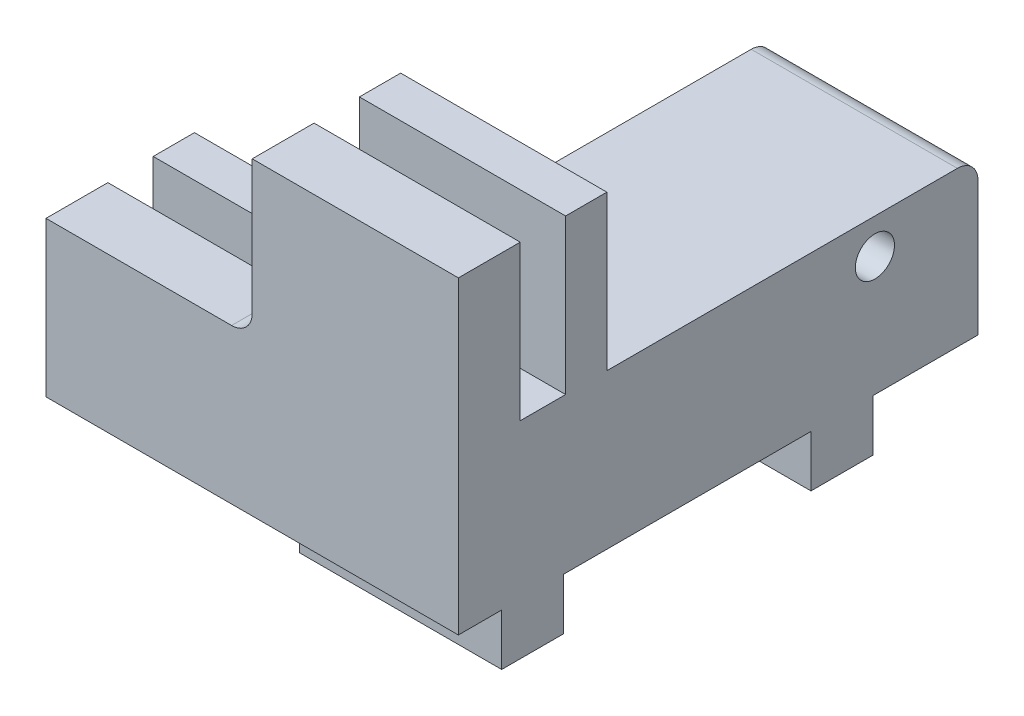
ISO-10303-21;
HEADER;
FILE_DESCRIPTION(('STEP AP214'),'2;1');
FILE_NAME('part.step','',(''),(''),'','','');
FILE_SCHEMA(('AUTOMOTIVE_DESIGN { 1 0 10303 214 1 1 1 1 }'));
ENDSEC;
DATA;
#1=APPLICATION_CONTEXT('core data for automotive mechanical design processes');
#2=APPLICATION_PROTOCOL_DEFINITION('international standard','automotive_design',2000,#1);
#3=PRODUCT_CONTEXT('',#1,'mechanical');
#4=PRODUCT('Part','Part','',(#3));
#5=PRODUCT_RELATED_PRODUCT_CATEGORY('part','',(#4));
#6=PRODUCT_DEFINITION_FORMATION('','',#4);
#7=PRODUCT_DEFINITION_CONTEXT('part definition',#1,'design');
#8=PRODUCT_DEFINITION('design','',#6,#7);
#9=PRODUCT_DEFINITION_SHAPE('','',#8);
#10=(LENGTH_UNIT() NAMED_UNIT(*) SI_UNIT(.MILLI.,.METRE.));
#11=(NAMED_UNIT(*) PLANE_ANGLE_UNIT() SI_UNIT($,.RADIAN.));
#12=(NAMED_UNIT(*) SI_UNIT($,.STERADIAN.) SOLID_ANGLE_UNIT());
#13=UNCERTAINTY_MEASURE_WITH_UNIT(LENGTH_MEASURE(1.E-05),#10,'distance_accuracy_value','');
#14=(GEOMETRIC_REPRESENTATION_CONTEXT(3) GLOBAL_UNCERTAINTY_ASSIGNED_CONTEXT((#13)) GLOBAL_UNIT_ASSIGNED_CONTEXT((#10,
#11,#12)) REPRESENTATION_CONTEXT('',''));
#15=CARTESIAN_POINT('',(0.,0.,0.));
#16=DIRECTION('',(0.,0.,1.));
#17=DIRECTION('',(1.,0.,0.));
#18=AXIS2_PLACEMENT_3D('',#15,#16,#17);
#19=CARTESIAN_POINT('',(-25.4,0.,0.));
#20=DIRECTION('',(0.,1.,0.));
#21=DIRECTION('',(0.,0.,1.));
#22=AXIS2_PLACEMENT_3D('',#19,#20,#21);
#23=PLANE('',#22);
#24=DIRECTION('',(0.,0.,1.));
#25=VECTOR('',#24,1.);
#26=CARTESIAN_POINT('',(0.508000000000001,0.,0.));
#27=LINE('',#26,#25);
#28=CARTESIAN_POINT('',(0.508000000000003,0.,20.462737041131));
#29=VERTEX_POINT('',#28);
#30=CARTESIAN_POINT('',(0.508000000000002,0.,28.082737041131));
#31=VERTEX_POINT('',#30);
#32=EDGE_CURVE('E265',#29,#31,#27,.T.);
#33=ORIENTED_EDGE('',*,*,#32,.T.);
#34=DIRECTION('',(1.,0.,0.));
#35=VECTOR('',#34,1.);
#36=CARTESIAN_POINT('',(0.,0.,28.082737041131));
#37=LINE('',#36,#35);
#38=CARTESIAN_POINT('',(25.4,0.,28.082737041131));
#39=VERTEX_POINT('',#38);
#40=EDGE_CURVE('E63',#31,#39,#37,.T.);
#41=ORIENTED_EDGE('',*,*,#40,.T.);
#42=DIRECTION('',(0.,0.,-1.));
#43=VECTOR('',#42,1.);
#44=CARTESIAN_POINT('',(25.4,0.,0.));
#45=LINE('',#44,#43);
#46=CARTESIAN_POINT('',(25.4,0.,33.416737041131));
#47=VERTEX_POINT('',#46);
#48=EDGE_CURVE('E370',#47,#39,#45,.T.);
#49=ORIENTED_EDGE('',*,*,#48,.F.);
#50=DIRECTION('',(1.,0.,0.));
#51=VECTOR('',#50,1.);
#52=CARTESIAN_POINT('',(-25.4,0.,33.416737041131));
#53=LINE('',#52,#51);
#54=CARTESIAN_POINT('',(-25.4,0.,33.416737041131));
#55=VERTEX_POINT('',#54);
#56=EDGE_CURVE('E475',#55,#47,#53,.T.);
#57=ORIENTED_EDGE('',*,*,#56,.F.);
#58=DIRECTION('',(0.,0.,1.));
#59=VECTOR('',#58,1.);
#60=CARTESIAN_POINT('',(-25.4,0.,0.));
#61=LINE('',#60,#59);
#62=CARTESIAN_POINT('',(-25.4,0.,15.128737041131));
#63=VERTEX_POINT('',#62);
#64=EDGE_CURVE('E463',#63,#55,#61,.T.);
#65=ORIENTED_EDGE('',*,*,#64,.F.);
#66=DIRECTION('',(1.,0.,0.));
#67=VECTOR('',#66,1.);
#68=CARTESIAN_POINT('',(-25.4,0.,15.128737041131));
#69=LINE('',#68,#67);
#70=CARTESIAN_POINT('',(0.,0.,15.128737041131));
#71=VERTEX_POINT('',#70);
#72=EDGE_CURVE('E470',#63,#71,#69,.T.);
#73=ORIENTED_EDGE('',*,*,#72,.T.);
#74=DIRECTION('',(0.,0.,-1.));
#75=VECTOR('',#74,1.);
#76=CARTESIAN_POINT('',(0.,0.,0.));
#77=LINE('',#76,#75);
#78=CARTESIAN_POINT('',(0.,0.,-30.591262958869));
#79=VERTEX_POINT('',#78);
#80=EDGE_CURVE('E374',#71,#79,#77,.T.);
#81=ORIENTED_EDGE('',*,*,#80,.T.);
#82=DIRECTION('',(-1.,0.,0.));
#83=VECTOR('',#82,1.);
#84=CARTESIAN_POINT('',(0.508,0.,-30.591262958869));
#85=LINE('',#84,#83);
#86=CARTESIAN_POINT('',(25.4,0.,-30.591262958869));
#87=VERTEX_POINT('',#86);
#88=EDGE_CURVE('E436',#87,#79,#85,.T.);
#89=ORIENTED_EDGE('',*,*,#88,.F.);
#90=CARTESIAN_POINT('',(25.4,0.,-17.637262958869));
#91=VERTEX_POINT('',#90);
#92=EDGE_CURVE('E369',#91,#87,#45,.T.);
#93=ORIENTED_EDGE('',*,*,#92,.F.);
#94=DIRECTION('',(1.,0.,0.));
#95=VECTOR('',#94,1.);
#96=CARTESIAN_POINT('',(0.,0.,-17.637262958869));
#97=LINE('',#96,#95);
#98=CARTESIAN_POINT('',(0.508000000000001,0.,-17.637262958869));
#99=VERTEX_POINT('',#98);
#100=EDGE_CURVE('E296',#99,#91,#97,.T.);
#101=ORIENTED_EDGE('',*,*,#100,.F.);
#102=DIRECTION('',(0.,0.,-1.));
#103=VECTOR('',#102,1.);
#104=CARTESIAN_POINT('',(0.507999999999999,0.,0.));
#105=LINE('',#104,#103);
#106=CARTESIAN_POINT('',(0.508,0.,-10.017262958869));
#107=VERTEX_POINT('',#106);
#108=EDGE_CURVE('E71',#107,#99,#105,.T.);
#109=ORIENTED_EDGE('',*,*,#108,.F.);
#110=DIRECTION('',(-1.,0.,0.));
#111=VECTOR('',#110,1.);
#112=CARTESIAN_POINT('',(0.,0.,-10.017262958869));
#113=LINE('',#112,#111);
#114=CARTESIAN_POINT('',(25.4,0.,-10.017262958869));
#115=VERTEX_POINT('',#114);
#116=EDGE_CURVE('E284',#115,#107,#113,.T.);
#117=ORIENTED_EDGE('',*,*,#116,.F.);
#118=CARTESIAN_POINT('',(25.4,0.,20.462737041131));
#119=VERTEX_POINT('',#118);
#120=EDGE_CURVE('E375',#119,#115,#45,.T.);
#121=ORIENTED_EDGE('',*,*,#120,.F.);
#122=DIRECTION('',(1.,0.,0.));
#123=VECTOR('',#122,1.);
#124=CARTESIAN_POINT('',(0.,0.,20.462737041131));
#125=LINE('',#124,#123);
#126=EDGE_CURVE('E250',#29,#119,#125,.T.);
#127=ORIENTED_EDGE('',*,*,#126,.F.);
#128=EDGE_LOOP('',(#33,#41,#49,#57,#65,#73,#81,#89,#93,#101,#109,#117,#121,#127));
#129=FACE_BOUND('',#128,.T.);
#130=ADVANCED_FACE('F47',(#129),#23,.F.);
#131=CARTESIAN_POINT('',(-25.4,0.,15.128737041131));
#132=DIRECTION('',(0.,0.,1.));
#133=DIRECTION('',(0.,-1.,0.));
#134=AXIS2_PLACEMENT_3D('',#131,#132,#133);
#135=PLANE('',#134);
#136=DIRECTION('',(0.,-1.,0.));
#137=VECTOR('',#136,1.);
#138=CARTESIAN_POINT('',(0.,0.,15.128737041131));
#139=LINE('',#138,#137);
#140=CARTESIAN_POINT('',(0.,19.05,15.128737041131));
#141=VERTEX_POINT('',#140);
#142=EDGE_CURVE('E440',#141,#71,#139,.T.);
#143=ORIENTED_EDGE('',*,*,#142,.T.);
#144=ORIENTED_EDGE('',*,*,#72,.F.);
#145=DIRECTION('',(0.,-1.,0.));
#146=VECTOR('',#145,1.);
#147=CARTESIAN_POINT('',(-25.4,0.,15.128737041131));
#148=LINE('',#147,#146);
#149=CARTESIAN_POINT('',(-25.4,19.05,15.128737041131));
#150=VERTEX_POINT('',#149);
#151=EDGE_CURVE('E441',#150,#63,#148,.T.);
#152=ORIENTED_EDGE('',*,*,#151,.F.);
#153=DIRECTION('',(1.,0.,0.));
#154=VECTOR('',#153,1.);
#155=CARTESIAN_POINT('',(-25.4,19.05,15.128737041131));
#156=LINE('',#155,#154);
#157=CARTESIAN_POINT('',(-2.54,19.05,15.128737041131));
#158=VERTEX_POINT('',#157);
#159=EDGE_CURVE('E466',#150,#158,#156,.T.);
#160=ORIENTED_EDGE('',*,*,#159,.T.);
#161=CARTESIAN_POINT('',(-2.54,21.59,15.128737041131));
#162=DIRECTION('',(0.,0.,1.));
#163=DIRECTION('',(0.,-1.,0.));
#164=AXIS2_PLACEMENT_3D('',#161,#162,#163);
#165=CIRCLE('',#164,2.54);
#166=CARTESIAN_POINT('',(0.,21.59,15.128737041131));
#167=VERTEX_POINT('',#166);
#168=EDGE_CURVE('E518',#158,#167,#165,.T.);
#169=ORIENTED_EDGE('',*,*,#168,.T.);
#170=DIRECTION('',(0.,1.,0.));
#171=VECTOR('',#170,1.);
#172=CARTESIAN_POINT('',(0.,0.,15.128737041131));
#173=LINE('',#172,#171);
#174=CARTESIAN_POINT('',(0.,38.1,15.128737041131));
#175=VERTEX_POINT('',#174);
#176=EDGE_CURVE('E394',#167,#175,#173,.T.);
#177=ORIENTED_EDGE('',*,*,#176,.T.);
#178=DIRECTION('',(-1.,0.,0.));
#179=VECTOR('',#178,1.);
#180=CARTESIAN_POINT('',(0.508,38.1,15.128737041131));
#181=LINE('',#180,#179);
#182=CARTESIAN_POINT('',(25.4,38.1,15.128737041131));
#183=VERTEX_POINT('',#182);
#184=EDGE_CURVE('E428',#183,#175,#181,.T.);
#185=ORIENTED_EDGE('',*,*,#184,.F.);
#186=DIRECTION('',(0.,1.,0.));
#187=VECTOR('',#186,1.);
#188=CARTESIAN_POINT('',(25.4,0.,15.128737041131));
#189=LINE('',#188,#187);
#190=CARTESIAN_POINT('',(25.4,19.05,15.128737041131));
#191=VERTEX_POINT('',#190);
#192=EDGE_CURVE('E342',#191,#183,#189,.T.);
#193=ORIENTED_EDGE('',*,*,#192,.F.);
#194=DIRECTION('',(-1.,0.,0.));
#195=VECTOR('',#194,1.);
#196=CARTESIAN_POINT('',(0.508,19.05,15.128737041131));
#197=LINE('',#196,#195);
#198=EDGE_CURVE('E432',#191,#141,#197,.T.);
#199=ORIENTED_EDGE('',*,*,#198,.T.);
#200=EDGE_LOOP('',(#143,#144,#152,#160,#169,#177,#185,#193,#199));
#201=FACE_BOUND('',#200,.T.);
#202=ADVANCED_FACE('F555',(#201),#135,.F.);
#203=CARTESIAN_POINT('',(-25.4,0.,33.416737041131));
#204=DIRECTION('',(0.,0.,-1.));
#205=DIRECTION('',(-1.,0.,0.));
#206=AXIS2_PLACEMENT_3D('',#203,#204,#205);
#207=PLANE('',#206);
#208=ORIENTED_EDGE('',*,*,#56,.T.);
#209=DIRECTION('',(0.,-1.,0.));
#210=VECTOR('',#209,1.);
#211=CARTESIAN_POINT('',(25.4,0.,33.416737041131));
#212=LINE('',#211,#210);
#213=CARTESIAN_POINT('',(25.4,38.1,33.416737041131));
#214=VERTEX_POINT('',#213);
#215=EDGE_CURVE('E320',#214,#47,#212,.T.);
#216=ORIENTED_EDGE('',*,*,#215,.F.);
#217=DIRECTION('',(-1.,0.,0.));
#218=VECTOR('',#217,1.);
#219=CARTESIAN_POINT('',(0.508,38.1,33.416737041131));
#220=LINE('',#219,#218);
#221=CARTESIAN_POINT('',(0.,38.1,33.416737041131));
#222=VERTEX_POINT('',#221);
#223=EDGE_CURVE('E384',#214,#222,#220,.T.);
#224=ORIENTED_EDGE('',*,*,#223,.T.);
#225=DIRECTION('',(0.,-1.,0.));
#226=VECTOR('',#225,1.);
#227=CARTESIAN_POINT('',(0.,0.,33.416737041131));
#228=LINE('',#227,#226);
#229=CARTESIAN_POINT('',(0.,21.59,33.416737041131));
#230=VERTEX_POINT('',#229);
#231=EDGE_CURVE('E411',#222,#230,#228,.T.);
#232=ORIENTED_EDGE('',*,*,#231,.T.);
#233=CARTESIAN_POINT('',(-2.54,21.59,33.416737041131));
#234=DIRECTION('',(0.,0.,-1.));
#235=DIRECTION('',(-1.,0.,0.));
#236=AXIS2_PLACEMENT_3D('',#233,#234,#235);
#237=CIRCLE('',#236,2.54);
#238=CARTESIAN_POINT('',(-2.54,19.05,33.416737041131));
#239=VERTEX_POINT('',#238);
#240=EDGE_CURVE('E515',#230,#239,#237,.T.);
#241=ORIENTED_EDGE('',*,*,#240,.T.);
#242=DIRECTION('',(1.,0.,0.));
#243=VECTOR('',#242,1.);
#244=CARTESIAN_POINT('',(-25.4,19.05,33.416737041131));
#245=LINE('',#244,#243);
#246=CARTESIAN_POINT('',(-25.4,19.05,33.416737041131));
#247=VERTEX_POINT('',#246);
#248=EDGE_CURVE('E478',#247,#239,#245,.T.);
#249=ORIENTED_EDGE('',*,*,#248,.F.);
#250=DIRECTION('',(0.,1.,0.));
#251=VECTOR('',#250,1.);
#252=CARTESIAN_POINT('',(-25.4,0.,33.416737041131));
#253=LINE('',#252,#251);
#254=EDGE_CURVE('E460',#55,#247,#253,.T.);
#255=ORIENTED_EDGE('',*,*,#254,.F.);
#256=EDGE_LOOP('',(#208,#216,#224,#232,#241,#249,#255));
#257=FACE_BOUND('',#256,.T.);
#258=ADVANCED_FACE('F582',(#257),#207,.F.);
#259=CARTESIAN_POINT('',(-25.4,19.05,0.));
#260=DIRECTION('',(0.,-1.,0.));
#261=DIRECTION('',(0.,0.,-1.));
#262=AXIS2_PLACEMENT_3D('',#259,#260,#261);
#263=PLANE('',#262);
#264=ORIENTED_EDGE('',*,*,#248,.T.);
#265=DIRECTION('',(0.,0.,-1.));
#266=VECTOR('',#265,1.);
#267=CARTESIAN_POINT('',(-2.54,19.05,25.796737041131));
#268=LINE('',#267,#266);
#269=CARTESIAN_POINT('',(-2.54,19.05,25.796737041131));
#270=VERTEX_POINT('',#269);
#271=EDGE_CURVE('E474',#239,#270,#268,.T.);
#272=ORIENTED_EDGE('',*,*,#271,.T.);
#273=DIRECTION('',(1.,0.,0.));
#274=VECTOR('',#273,1.);
#275=CARTESIAN_POINT('',(-25.4,19.05,25.796737041131));
#276=LINE('',#275,#274);
#277=CARTESIAN_POINT('',(-25.4,19.05,25.796737041131));
#278=VERTEX_POINT('',#277);
#279=EDGE_CURVE('E482',#278,#270,#276,.T.);
#280=ORIENTED_EDGE('',*,*,#279,.F.);
#281=DIRECTION('',(0.,0.,-1.));
#282=VECTOR('',#281,1.);
#283=CARTESIAN_POINT('',(-25.4,19.05,0.));
#284=LINE('',#283,#282);
#285=EDGE_CURVE('E457',#247,#278,#284,.T.);
#286=ORIENTED_EDGE('',*,*,#285,.F.);
#287=EDGE_LOOP('',(#264,#272,#280,#286));
#288=FACE_BOUND('',#287,.T.);
#289=ADVANCED_FACE('F656',(#288),#263,.F.);
#290=CARTESIAN_POINT('',(-25.4,0.,25.796737041131));
#291=DIRECTION('',(0.,0.,1.));
#292=DIRECTION('',(1.,0.,0.));
#293=AXIS2_PLACEMENT_3D('',#290,#291,#292);
#294=PLANE('',#293);
#295=ORIENTED_EDGE('',*,*,#279,.T.);
#296=CARTESIAN_POINT('',(-2.54,21.59,25.796737041131));
#297=DIRECTION('',(0.,0.,1.));
#298=DIRECTION('',(1.,0.,0.));
#299=AXIS2_PLACEMENT_3D('',#296,#297,#298);
#300=CIRCLE('',#299,2.54);
#301=CARTESIAN_POINT('',(0.,21.59,25.796737041131));
#302=VERTEX_POINT('',#301);
#303=EDGE_CURVE('E512',#270,#302,#300,.T.);
#304=ORIENTED_EDGE('',*,*,#303,.T.);
#305=DIRECTION('',(0.,1.,0.));
#306=VECTOR('',#305,1.);
#307=CARTESIAN_POINT('',(0.,0.,25.796737041131));
#308=LINE('',#307,#306);
#309=CARTESIAN_POINT('',(0.,38.1,25.796737041131));
#310=VERTEX_POINT('',#309);
#311=EDGE_CURVE('E404',#302,#310,#308,.T.);
#312=ORIENTED_EDGE('',*,*,#311,.T.);
#313=DIRECTION('',(-1.,0.,0.));
#314=VECTOR('',#313,1.);
#315=CARTESIAN_POINT('',(0.508,38.1,25.796737041131));
#316=LINE('',#315,#314);
#317=CARTESIAN_POINT('',(25.4,38.1,25.796737041131));
#318=VERTEX_POINT('',#317);
#319=EDGE_CURVE('E420',#318,#310,#316,.T.);
#320=ORIENTED_EDGE('',*,*,#319,.F.);
#321=DIRECTION('',(0.,1.,0.));
#322=VECTOR('',#321,1.);
#323=CARTESIAN_POINT('',(25.4,0.,25.796737041131));
#324=LINE('',#323,#322);
#325=CARTESIAN_POINT('',(25.4,19.05,25.796737041131));
#326=VERTEX_POINT('',#325);
#327=EDGE_CURVE('E327',#326,#318,#324,.T.);
#328=ORIENTED_EDGE('',*,*,#327,.F.);
#329=DIRECTION('',(-1.,0.,0.));
#330=VECTOR('',#329,1.);
#331=CARTESIAN_POINT('',(67.6618142535315,19.05,25.796737041131));
#332=LINE('',#331,#330);
#333=CARTESIAN_POINT('',(0.508,19.05,25.796737041131));
#334=VERTEX_POINT('',#333);
#335=EDGE_CURVE('E321',#326,#334,#332,.T.);
#336=ORIENTED_EDGE('',*,*,#335,.T.);
#337=DIRECTION('',(0.,1.,0.));
#338=VECTOR('',#337,1.);
#339=CARTESIAN_POINT('',(0.508,0.,25.796737041131));
#340=LINE('',#339,#338);
#341=CARTESIAN_POINT('',(0.508,10.922,25.796737041131));
#342=VERTEX_POINT('',#341);
#343=EDGE_CURVE('E380',#342,#334,#340,.T.);
#344=ORIENTED_EDGE('',*,*,#343,.F.);
#345=DIRECTION('',(1.,0.,0.));
#346=VECTOR('',#345,1.);
#347=CARTESIAN_POINT('',(-25.4,10.922,25.796737041131));
#348=LINE('',#347,#346);
#349=CARTESIAN_POINT('',(-25.4,10.922,25.796737041131));
#350=VERTEX_POINT('',#349);
#351=EDGE_CURVE('E486',#350,#342,#348,.T.);
#352=ORIENTED_EDGE('',*,*,#351,.F.);
#353=DIRECTION('',(0.,-1.,0.));
#354=VECTOR('',#353,1.);
#355=CARTESIAN_POINT('',(-25.4,0.,25.796737041131));
#356=LINE('',#355,#354);
#357=EDGE_CURVE('E454',#278,#350,#356,.T.);
#358=ORIENTED_EDGE('',*,*,#357,.F.);
#359=EDGE_LOOP('',(#295,#304,#312,#320,#328,#336,#344,#352,#358));
#360=FACE_BOUND('',#359,.T.);
#361=ADVANCED_FACE('F572',(#360),#294,.F.);
#362=CARTESIAN_POINT('',(-25.4,10.922,0.));
#363=DIRECTION('',(0.,-1.,0.));
#364=DIRECTION('',(0.,0.,-1.));
#365=AXIS2_PLACEMENT_3D('',#362,#363,#364);
#366=PLANE('',#365);
#367=ORIENTED_EDGE('',*,*,#351,.T.);
#368=DIRECTION('',(0.,0.,1.));
#369=VECTOR('',#368,1.);
#370=CARTESIAN_POINT('',(0.508,10.922,0.));
#371=LINE('',#370,#369);
#372=CARTESIAN_POINT('',(0.508,10.922,20.208737041131));
#373=VERTEX_POINT('',#372);
#374=EDGE_CURVE('E376',#373,#342,#371,.T.);
#375=ORIENTED_EDGE('',*,*,#374,.F.);
#376=DIRECTION('',(1.,0.,0.));
#377=VECTOR('',#376,1.);
#378=CARTESIAN_POINT('',(-25.4,10.922,20.208737041131));
#379=LINE('',#378,#377);
#380=CARTESIAN_POINT('',(-25.4,10.922,20.208737041131));
#381=VERTEX_POINT('',#380);
#382=EDGE_CURVE('E489',#381,#373,#379,.T.);
#383=ORIENTED_EDGE('',*,*,#382,.F.);
#384=DIRECTION('',(0.,0.,-1.));
#385=VECTOR('',#384,1.);
#386=CARTESIAN_POINT('',(-25.4,10.922,0.));
#387=LINE('',#386,#385);
#388=EDGE_CURVE('E451',#350,#381,#387,.T.);
#389=ORIENTED_EDGE('',*,*,#388,.F.);
#390=EDGE_LOOP('',(#367,#375,#383,#389));
#391=FACE_BOUND('',#390,.T.);
#392=ADVANCED_FACE('F628',(#391),#366,.F.);
#393=CARTESIAN_POINT('',(-25.4,0.,20.208737041131));
#394=DIRECTION('',(0.,0.,-1.));
#395=DIRECTION('',(-1.,0.,0.));
#396=AXIS2_PLACEMENT_3D('',#393,#394,#395);
#397=PLANE('',#396);
#398=ORIENTED_EDGE('',*,*,#382,.T.);
#399=DIRECTION('',(0.,-1.,0.));
#400=VECTOR('',#399,1.);
#401=CARTESIAN_POINT('',(0.508000000000002,0.,20.208737041131));
#402=LINE('',#401,#400);
#403=CARTESIAN_POINT('',(0.508,19.05,20.208737041131));
#404=VERTEX_POINT('',#403);
#405=EDGE_CURVE('E326',#404,#373,#402,.T.);
#406=ORIENTED_EDGE('',*,*,#405,.F.);
#407=DIRECTION('',(-1.,0.,0.));
#408=VECTOR('',#407,1.);
#409=CARTESIAN_POINT('',(67.6618142535315,19.05,20.208737041131));
#410=LINE('',#409,#408);
#411=CARTESIAN_POINT('',(25.4,19.05,20.208737041131));
#412=VERTEX_POINT('',#411);
#413=EDGE_CURVE('E334',#412,#404,#410,.T.);
#414=ORIENTED_EDGE('',*,*,#413,.F.);
#415=DIRECTION('',(0.,-1.,0.));
#416=VECTOR('',#415,1.);
#417=CARTESIAN_POINT('',(25.4,0.,20.208737041131));
#418=LINE('',#417,#416);
#419=CARTESIAN_POINT('',(25.4,38.1,20.208737041131));
#420=VERTEX_POINT('',#419);
#421=EDGE_CURVE('E331',#420,#412,#418,.T.);
#422=ORIENTED_EDGE('',*,*,#421,.F.);
#423=DIRECTION('',(-1.,0.,0.));
#424=VECTOR('',#423,1.);
#425=CARTESIAN_POINT('',(0.508,38.1,20.208737041131));
#426=LINE('',#425,#424);
#427=CARTESIAN_POINT('',(0.,38.1,20.208737041131));
#428=VERTEX_POINT('',#427);
#429=EDGE_CURVE('E424',#420,#428,#426,.T.);
#430=ORIENTED_EDGE('',*,*,#429,.T.);
#431=DIRECTION('',(0.,-1.,0.));
#432=VECTOR('',#431,1.);
#433=CARTESIAN_POINT('',(0.,0.,20.208737041131));
#434=LINE('',#433,#432);
#435=CARTESIAN_POINT('',(0.,21.59,20.208737041131));
#436=VERTEX_POINT('',#435);
#437=EDGE_CURVE('E400',#428,#436,#434,.T.);
#438=ORIENTED_EDGE('',*,*,#437,.T.);
#439=CARTESIAN_POINT('',(-2.54,21.59,20.208737041131));
#440=DIRECTION('',(0.,0.,-1.));
#441=DIRECTION('',(-1.,0.,0.));
#442=AXIS2_PLACEMENT_3D('',#439,#440,#441);
#443=CIRCLE('',#442,2.54);
#444=CARTESIAN_POINT('',(-2.54,19.05,20.208737041131));
#445=VERTEX_POINT('',#444);
#446=EDGE_CURVE('E522',#436,#445,#443,.T.);
#447=ORIENTED_EDGE('',*,*,#446,.T.);
#448=DIRECTION('',(1.,0.,0.));
#449=VECTOR('',#448,1.);
#450=CARTESIAN_POINT('',(-25.4,19.05,20.208737041131));
#451=LINE('',#450,#449);
#452=CARTESIAN_POINT('',(-25.4,19.05,20.208737041131));
#453=VERTEX_POINT('',#452);
#454=EDGE_CURVE('E492',#453,#445,#451,.T.);
#455=ORIENTED_EDGE('',*,*,#454,.F.);
#456=DIRECTION('',(0.,1.,0.));
#457=VECTOR('',#456,1.);
#458=CARTESIAN_POINT('',(-25.4,0.,20.208737041131));
#459=LINE('',#458,#457);
#460=EDGE_CURVE('E448',#381,#453,#459,.T.);
#461=ORIENTED_EDGE('',*,*,#460,.F.);
#462=EDGE_LOOP('',(#398,#406,#414,#422,#430,#438,#447,#455,#461));
#463=FACE_BOUND('',#462,.T.);
#464=ADVANCED_FACE('F564',(#463),#397,.F.);
#465=CARTESIAN_POINT('',(-25.4,19.05,0.));
#466=DIRECTION('',(0.,-1.,0.));
#467=DIRECTION('',(0.,0.,-1.));
#468=AXIS2_PLACEMENT_3D('',#465,#466,#467);
#469=PLANE('',#468);
#470=ORIENTED_EDGE('',*,*,#454,.T.);
#471=DIRECTION('',(0.,0.,-1.));
#472=VECTOR('',#471,1.);
#473=CARTESIAN_POINT('',(-2.54,19.05,15.128737041131));
#474=LINE('',#473,#472);
#475=EDGE_CURVE('E505',#445,#158,#474,.T.);
#476=ORIENTED_EDGE('',*,*,#475,.T.);
#477=ORIENTED_EDGE('',*,*,#159,.F.);
#478=DIRECTION('',(0.,0.,-1.));
#479=VECTOR('',#478,1.);
#480=CARTESIAN_POINT('',(-25.4,19.05,0.));
#481=LINE('',#480,#479);
#482=EDGE_CURVE('E445',#453,#150,#481,.T.);
#483=ORIENTED_EDGE('',*,*,#482,.F.);
#484=EDGE_LOOP('',(#470,#476,#477,#483));
#485=FACE_BOUND('',#484,.T.);
#486=ADVANCED_FACE('F616',(#485),#469,.F.);
#487=CARTESIAN_POINT('',(-25.4,0.,0.));
#488=DIRECTION('',(1.,0.,0.));
#489=DIRECTION('',(0.,0.,-1.));
#490=AXIS2_PLACEMENT_3D('',#487,#488,#489);
#491=PLANE('',#490);
#492=ORIENTED_EDGE('',*,*,#151,.T.);
#493=ORIENTED_EDGE('',*,*,#64,.T.);
#494=ORIENTED_EDGE('',*,*,#254,.T.);
#495=ORIENTED_EDGE('',*,*,#285,.T.);
#496=ORIENTED_EDGE('',*,*,#357,.T.);
#497=ORIENTED_EDGE('',*,*,#388,.T.);
#498=ORIENTED_EDGE('',*,*,#460,.T.);
#499=ORIENTED_EDGE('',*,*,#482,.T.);
#500=EDGE_LOOP('',(#492,#493,#494,#495,#496,#497,#498,#499));
#501=FACE_BOUND('',#500,.T.);
#502=ADVANCED_FACE('F611',(#501),#491,.F.);
#503=CARTESIAN_POINT('',(0.,0.,0.));
#504=DIRECTION('',(1.,0.,0.));
#505=DIRECTION('',(0.,0.,-1.));
#506=AXIS2_PLACEMENT_3D('',#503,#504,#505);
#507=PLANE('',#506);
#508=DIRECTION('',(0.,0.,1.));
#509=VECTOR('',#508,1.);
#510=CARTESIAN_POINT('',(0.,19.05,0.));
#511=LINE('',#510,#509);
#512=CARTESIAN_POINT('',(0.,19.05,-28.051262958869));
#513=VERTEX_POINT('',#512);
#514=EDGE_CURVE('E391',#513,#141,#511,.T.);
#515=ORIENTED_EDGE('',*,*,#514,.F.);
#516=CARTESIAN_POINT('',(0.,16.51,-28.051262958869));
#517=DIRECTION('',(1.,0.,0.));
#518=DIRECTION('',(0.,0.,-1.));
#519=AXIS2_PLACEMENT_3D('',#516,#517,#518);
#520=CIRCLE('',#519,2.54);
#521=CARTESIAN_POINT('',(0.,16.51,-30.591262958869));
#522=VERTEX_POINT('',#521);
#523=EDGE_CURVE('E529',#513,#522,#520,.F.);
#524=ORIENTED_EDGE('',*,*,#523,.T.);
#525=DIRECTION('',(0.,1.,0.));
#526=VECTOR('',#525,1.);
#527=CARTESIAN_POINT('',(0.,0.,-30.591262958869));
#528=LINE('',#527,#526);
#529=EDGE_CURVE('E387',#79,#522,#528,.T.);
#530=ORIENTED_EDGE('',*,*,#529,.F.);
#531=ORIENTED_EDGE('',*,*,#80,.F.);
#532=ORIENTED_EDGE('',*,*,#142,.F.);
#533=EDGE_LOOP('',(#515,#524,#530,#531,#532));
#534=FACE_BOUND('',#533,.T.);
#535=CARTESIAN_POINT('',(0.,14.732,-17.891262958869));
#536=DIRECTION('',(1.,0.,0.));
#537=DIRECTION('',(0.,0.,-1.));
#538=AXIS2_PLACEMENT_3D('',#535,#536,#537);
#539=CIRCLE('',#538,2.413);
#540=CARTESIAN_POINT('',(0.,14.732,-20.304262958869));
#541=VERTEX_POINT('',#540);
#542=EDGE_CURVE('E381',#541,#541,#539,.T.);
#543=ORIENTED_EDGE('',*,*,#542,.T.);
#544=EDGE_LOOP('',(#543));
#545=FACE_BOUND('',#544,.T.);
#546=ADVANCED_FACE('F550',(#534,#545),#507,.F.);
#547=ORIENTED_EDGE('',*,*,#176,.F.);
#548=DIRECTION('',(0.,0.,-1.));
#549=VECTOR('',#548,1.);
#550=CARTESIAN_POINT('',(0.,21.59,20.208737041131));
#551=LINE('',#550,#549);
#552=EDGE_CURVE('E509',#167,#436,#551,.F.);
#553=ORIENTED_EDGE('',*,*,#552,.T.);
#554=ORIENTED_EDGE('',*,*,#437,.F.);
#555=DIRECTION('',(0.,0.,1.));
#556=VECTOR('',#555,1.);
#557=CARTESIAN_POINT('',(0.,38.1,0.));
#558=LINE('',#557,#556);
#559=EDGE_CURVE('E397',#175,#428,#558,.T.);
#560=ORIENTED_EDGE('',*,*,#559,.F.);
#561=EDGE_LOOP('',(#547,#553,#554,#560));
#562=FACE_BOUND('',#561,.T.);
#563=ADVANCED_FACE('F623',(#562),#507,.F.);
#564=CARTESIAN_POINT('',(0.508,0.,-30.591262958869));
#565=DIRECTION('',(0.,0.,1.));
#566=DIRECTION('',(0.,-1.,0.));
#567=AXIS2_PLACEMENT_3D('',#564,#565,#566);
#568=PLANE('',#567);
#569=ORIENTED_EDGE('',*,*,#529,.T.);
#570=DIRECTION('',(-1.,0.,0.));
#571=VECTOR('',#570,1.);
#572=CARTESIAN_POINT('',(0.508,16.51,-30.591262958869));
#573=LINE('',#572,#571);
#574=CARTESIAN_POINT('',(25.4,16.51,-30.591262958869));
#575=VERTEX_POINT('',#574);
#576=EDGE_CURVE('E56',#522,#575,#573,.F.);
#577=ORIENTED_EDGE('',*,*,#576,.T.);
#578=DIRECTION('',(0.,1.,0.));
#579=VECTOR('',#578,1.);
#580=CARTESIAN_POINT('',(25.4,0.,-30.591262958869));
#581=LINE('',#580,#579);
#582=EDGE_CURVE('E362',#87,#575,#581,.T.);
#583=ORIENTED_EDGE('',*,*,#582,.F.);
#584=ORIENTED_EDGE('',*,*,#88,.T.);
#585=EDGE_LOOP('',(#569,#577,#583,#584));
#586=FACE_BOUND('',#585,.T.);
#587=ADVANCED_FACE('F535',(#586),#568,.F.);
#588=CARTESIAN_POINT('',(0.508,19.05,0.));
#589=DIRECTION('',(0.,-1.,0.));
#590=DIRECTION('',(0.,0.,-1.));
#591=AXIS2_PLACEMENT_3D('',#588,#589,#590);
#592=PLANE('',#591);
#593=DIRECTION('',(0.,0.,1.));
#594=VECTOR('',#593,1.);
#595=CARTESIAN_POINT('',(25.4,19.05,0.));
#596=LINE('',#595,#594);
#597=CARTESIAN_POINT('',(25.4,19.05,-28.051262958869));
#598=VERTEX_POINT('',#597);
#599=EDGE_CURVE('E366',#598,#191,#596,.T.);
#600=ORIENTED_EDGE('',*,*,#599,.F.);
#601=DIRECTION('',(-1.,0.,0.));
#602=VECTOR('',#601,1.);
#603=CARTESIAN_POINT('',(0.508,19.05,-28.051262958869));
#604=LINE('',#603,#602);
#605=EDGE_CURVE('E525',#598,#513,#604,.T.);
#606=ORIENTED_EDGE('',*,*,#605,.T.);
#607=ORIENTED_EDGE('',*,*,#514,.T.);
#608=ORIENTED_EDGE('',*,*,#198,.F.);
#609=EDGE_LOOP('',(#600,#606,#607,#608));
#610=FACE_BOUND('',#609,.T.);
#611=ADVANCED_FACE('F546',(#610),#592,.F.);
#612=CARTESIAN_POINT('',(0.508,38.1,0.));
#613=DIRECTION('',(0.,-1.,0.));
#614=DIRECTION('',(0.,0.,-1.));
#615=AXIS2_PLACEMENT_3D('',#612,#613,#614);
#616=PLANE('',#615);
#617=ORIENTED_EDGE('',*,*,#559,.T.);
#618=ORIENTED_EDGE('',*,*,#429,.F.);
#619=DIRECTION('',(0.,0.,1.));
#620=VECTOR('',#619,1.);
#621=CARTESIAN_POINT('',(25.4,38.1,0.));
#622=LINE('',#621,#620);
#623=EDGE_CURVE('E338',#183,#420,#622,.T.);
#624=ORIENTED_EDGE('',*,*,#623,.F.);
#625=ORIENTED_EDGE('',*,*,#184,.T.);
#626=EDGE_LOOP('',(#617,#618,#624,#625));
#627=FACE_BOUND('',#626,.T.);
#628=ADVANCED_FACE('F558',(#627),#616,.F.);
#629=CARTESIAN_POINT('',(0.508,38.1,0.));
#630=DIRECTION('',(0.,1.,0.));
#631=DIRECTION('',(0.,0.,1.));
#632=AXIS2_PLACEMENT_3D('',#629,#630,#631);
#633=PLANE('',#632);
#634=DIRECTION('',(0.,0.,-1.));
#635=VECTOR('',#634,1.);
#636=CARTESIAN_POINT('',(0.,38.1,0.));
#637=LINE('',#636,#635);
#638=EDGE_CURVE('E407',#222,#310,#637,.T.);
#639=ORIENTED_EDGE('',*,*,#638,.F.);
#640=ORIENTED_EDGE('',*,*,#223,.F.);
#641=DIRECTION('',(0.,0.,1.));
#642=VECTOR('',#641,1.);
#643=CARTESIAN_POINT('',(25.4,38.1,0.));
#644=LINE('',#643,#642);
#645=EDGE_CURVE('E322',#318,#214,#644,.T.);
#646=ORIENTED_EDGE('',*,*,#645,.F.);
#647=ORIENTED_EDGE('',*,*,#319,.T.);
#648=EDGE_LOOP('',(#639,#640,#646,#647));
#649=FACE_BOUND('',#648,.T.);
#650=ADVANCED_FACE('F578',(#649),#633,.T.);
#651=CARTESIAN_POINT('',(0.508,14.732,-17.891262958869));
#652=DIRECTION('',(-1.,0.,0.));
#653=DIRECTION('',(0.,0.,1.));
#654=AXIS2_PLACEMENT_3D('',#651,#652,#653);
#655=CYLINDRICAL_SURFACE('',#654,2.413);
#656=ORIENTED_EDGE('',*,*,#542,.F.);
#657=EDGE_LOOP('',(#656));
#658=FACE_BOUND('',#657,.T.);
#659=CARTESIAN_POINT('',(25.4,14.732,-17.891262958869));
#660=DIRECTION('',(1.,0.,0.));
#661=DIRECTION('',(0.,0.,-1.));
#662=AXIS2_PLACEMENT_3D('',#659,#660,#661);
#663=CIRCLE('',#662,2.413);
#664=CARTESIAN_POINT('',(25.4,14.732,-20.304262958869));
#665=VERTEX_POINT('',#664);
#666=EDGE_CURVE('E358',#665,#665,#663,.T.);
#667=ORIENTED_EDGE('',*,*,#666,.T.);
#668=EDGE_LOOP('',(#667));
#669=FACE_BOUND('',#668,.T.);
#670=ADVANCED_FACE('F811',(#658,#669),#655,.F.);
#671=ORIENTED_EDGE('',*,*,#311,.F.);
#672=DIRECTION('',(0.,0.,-1.));
#673=VECTOR('',#672,1.);
#674=CARTESIAN_POINT('',(0.,21.59,33.416737041131));
#675=LINE('',#674,#673);
#676=EDGE_CURVE('E502',#302,#230,#675,.F.);
#677=ORIENTED_EDGE('',*,*,#676,.T.);
#678=ORIENTED_EDGE('',*,*,#231,.F.);
#679=ORIENTED_EDGE('',*,*,#638,.T.);
#680=EDGE_LOOP('',(#671,#677,#678,#679));
#681=FACE_BOUND('',#680,.T.);
#682=ADVANCED_FACE('F640',(#681),#507,.F.);
#683=CARTESIAN_POINT('',(25.4,0.,0.));
#684=DIRECTION('',(1.,0.,0.));
#685=DIRECTION('',(0.,0.,-1.));
#686=AXIS2_PLACEMENT_3D('',#683,#684,#685);
#687=PLANE('',#686);
#688=ORIENTED_EDGE('',*,*,#666,.F.);
#689=EDGE_LOOP('',(#688));
#690=FACE_BOUND('',#689,.T.);
#691=ORIENTED_EDGE('',*,*,#582,.T.);
#692=CARTESIAN_POINT('',(25.4,16.51,-28.051262958869));
#693=DIRECTION('',(1.,0.,0.));
#694=DIRECTION('',(0.,0.,-1.));
#695=AXIS2_PLACEMENT_3D('',#692,#693,#694);
#696=CIRCLE('',#695,2.54);
#697=EDGE_CURVE('E11',#575,#598,#696,.T.);
#698=ORIENTED_EDGE('',*,*,#697,.T.);
#699=ORIENTED_EDGE('',*,*,#599,.T.);
#700=ORIENTED_EDGE('',*,*,#192,.T.);
#701=ORIENTED_EDGE('',*,*,#623,.T.);
#702=ORIENTED_EDGE('',*,*,#421,.T.);
#703=DIRECTION('',(0.,0.,-1.));
#704=VECTOR('',#703,1.);
#705=CARTESIAN_POINT('',(25.4,19.05,0.));
#706=LINE('',#705,#704);
#707=EDGE_CURVE('E239',#326,#412,#706,.T.);
#708=ORIENTED_EDGE('',*,*,#707,.F.);
#709=ORIENTED_EDGE('',*,*,#327,.T.);
#710=ORIENTED_EDGE('',*,*,#645,.T.);
#711=ORIENTED_EDGE('',*,*,#215,.T.);
#712=ORIENTED_EDGE('',*,*,#48,.T.);
#713=DIRECTION('',(0.,1.,0.));
#714=VECTOR('',#713,1.);
#715=CARTESIAN_POINT('',(25.4,-6.35,28.082737041131));
#716=LINE('',#715,#714);
#717=CARTESIAN_POINT('',(25.4,-6.35,28.082737041131));
#718=VERTEX_POINT('',#717);
#719=EDGE_CURVE('E262',#718,#39,#716,.T.);
#720=ORIENTED_EDGE('',*,*,#719,.F.);
#721=DIRECTION('',(0.,0.,1.));
#722=VECTOR('',#721,1.);
#723=CARTESIAN_POINT('',(25.4,-6.35,0.));
#724=LINE('',#723,#722);
#725=CARTESIAN_POINT('',(25.4,-6.35,20.462737041131));
#726=VERTEX_POINT('',#725);
#727=EDGE_CURVE('E247',#726,#718,#724,.T.);
#728=ORIENTED_EDGE('',*,*,#727,.F.);
#729=DIRECTION('',(0.,1.,0.));
#730=VECTOR('',#729,1.);
#731=CARTESIAN_POINT('',(25.4,-6.35,20.462737041131));
#732=LINE('',#731,#730);
#733=EDGE_CURVE('E273',#726,#119,#732,.T.);
#734=ORIENTED_EDGE('',*,*,#733,.T.);
#735=ORIENTED_EDGE('',*,*,#120,.T.);
#736=DIRECTION('',(0.,1.,0.));
#737=VECTOR('',#736,1.);
#738=CARTESIAN_POINT('',(25.4,-6.35,-10.017262958869));
#739=LINE('',#738,#737);
#740=CARTESIAN_POINT('',(25.4,-6.35,-10.017262958869));
#741=VERTEX_POINT('',#740);
#742=EDGE_CURVE('E305',#741,#115,#739,.T.);
#743=ORIENTED_EDGE('',*,*,#742,.F.);
#744=DIRECTION('',(0.,0.,1.));
#745=VECTOR('',#744,1.);
#746=CARTESIAN_POINT('',(25.4,-6.35,0.));
#747=LINE('',#746,#745);
#748=CARTESIAN_POINT('',(25.4,-6.35,-17.637262958869));
#749=VERTEX_POINT('',#748);
#750=EDGE_CURVE('E287',#749,#741,#747,.T.);
#751=ORIENTED_EDGE('',*,*,#750,.F.);
#752=DIRECTION('',(0.,1.,0.));
#753=VECTOR('',#752,1.);
#754=CARTESIAN_POINT('',(25.4,-6.35,-17.637262958869));
#755=LINE('',#754,#753);
#756=EDGE_CURVE('E309',#749,#91,#755,.T.);
#757=ORIENTED_EDGE('',*,*,#756,.T.);
#758=ORIENTED_EDGE('',*,*,#92,.T.);
#759=EDGE_LOOP('',(#691,#698,#699,#700,#701,#702,#708,#709,#710,#711,#712,#720,#728,#734,#735,
#743,#751,#757,#758));
#760=FACE_BOUND('',#759,.T.);
#761=ADVANCED_FACE('F540',(#690,#760),#687,.T.);
#762=CARTESIAN_POINT('',(0.508,0.,0.));
#763=DIRECTION('',(1.,0.,0.));
#764=DIRECTION('',(0.,0.,-1.));
#765=AXIS2_PLACEMENT_3D('',#762,#763,#764);
#766=PLANE('',#765);
#767=ORIENTED_EDGE('',*,*,#374,.T.);
#768=ORIENTED_EDGE('',*,*,#343,.T.);
#769=DIRECTION('',(0.,0.,-1.));
#770=VECTOR('',#769,1.);
#771=CARTESIAN_POINT('',(0.508,19.05,0.));
#772=LINE('',#771,#770);
#773=EDGE_CURVE('E316',#334,#404,#772,.T.);
#774=ORIENTED_EDGE('',*,*,#773,.T.);
#775=ORIENTED_EDGE('',*,*,#405,.T.);
#776=EDGE_LOOP('',(#767,#768,#774,#775));
#777=FACE_BOUND('',#776,.T.);
#778=ADVANCED_FACE('F630',(#777),#766,.F.);
#779=CARTESIAN_POINT('',(67.6618142535315,19.05,0.));
#780=DIRECTION('',(0.,1.,0.));
#781=DIRECTION('',(0.,0.,1.));
#782=AXIS2_PLACEMENT_3D('',#779,#780,#781);
#783=PLANE('',#782);
#784=ORIENTED_EDGE('',*,*,#335,.F.);
#785=ORIENTED_EDGE('',*,*,#707,.T.);
#786=ORIENTED_EDGE('',*,*,#413,.T.);
#787=ORIENTED_EDGE('',*,*,#773,.F.);
#788=EDGE_LOOP('',(#784,#785,#786,#787));
#789=FACE_BOUND('',#788,.T.);
#790=ADVANCED_FACE('F568',(#789),#783,.T.);
#791=CARTESIAN_POINT('',(-2.54,21.59,0.));
#792=DIRECTION('',(0.,0.,1.));
#793=DIRECTION('',(0.,-1.,0.));
#794=AXIS2_PLACEMENT_3D('',#791,#792,#793);
#795=CYLINDRICAL_SURFACE('',#794,2.54);
#796=ORIENTED_EDGE('',*,*,#240,.F.);
#797=ORIENTED_EDGE('',*,*,#676,.F.);
#798=ORIENTED_EDGE('',*,*,#303,.F.);
#799=ORIENTED_EDGE('',*,*,#271,.F.);
#800=EDGE_LOOP('',(#796,#797,#798,#799));
#801=FACE_BOUND('',#800,.T.);
#802=ADVANCED_FACE('F637',(#801),#795,.F.);
#803=CARTESIAN_POINT('',(-2.54,21.59,0.));
#804=DIRECTION('',(0.,0.,1.));
#805=DIRECTION('',(0.,-1.,0.));
#806=AXIS2_PLACEMENT_3D('',#803,#804,#805);
#807=CYLINDRICAL_SURFACE('',#806,2.54);
#808=ORIENTED_EDGE('',*,*,#446,.F.);
#809=ORIENTED_EDGE('',*,*,#552,.F.);
#810=ORIENTED_EDGE('',*,*,#168,.F.);
#811=ORIENTED_EDGE('',*,*,#475,.F.);
#812=EDGE_LOOP('',(#808,#809,#810,#811));
#813=FACE_BOUND('',#812,.T.);
#814=ADVANCED_FACE('F620',(#813),#807,.F.);
#815=CARTESIAN_POINT('',(0.508,16.51,-28.051262958869));
#816=DIRECTION('',(-1.,0.,0.));
#817=DIRECTION('',(0.,0.,1.));
#818=AXIS2_PLACEMENT_3D('',#815,#816,#817);
#819=CYLINDRICAL_SURFACE('',#818,2.54);
#820=ORIENTED_EDGE('',*,*,#697,.F.);
#821=ORIENTED_EDGE('',*,*,#576,.F.);
#822=ORIENTED_EDGE('',*,*,#523,.F.);
#823=ORIENTED_EDGE('',*,*,#605,.F.);
#824=EDGE_LOOP('',(#820,#821,#822,#823));
#825=FACE_BOUND('',#824,.T.);
#826=ADVANCED_FACE('F49',(#825),#819,.T.);
#827=CARTESIAN_POINT('',(0.507999999999999,-6.35,0.));
#828=DIRECTION('',(1.,0.,0.));
#829=DIRECTION('',(0.,0.,-1.));
#830=AXIS2_PLACEMENT_3D('',#827,#828,#829);
#831=PLANE('',#830);
#832=ORIENTED_EDGE('',*,*,#108,.T.);
#833=DIRECTION('',(0.,1.,0.));
#834=VECTOR('',#833,1.);
#835=CARTESIAN_POINT('',(0.508000000000001,-6.35,-17.637262958869));
#836=LINE('',#835,#834);
#837=CARTESIAN_POINT('',(0.508000000000001,-6.35,-17.637262958869));
#838=VERTEX_POINT('',#837);
#839=EDGE_CURVE('E266',#838,#99,#836,.T.);
#840=ORIENTED_EDGE('',*,*,#839,.F.);
#841=DIRECTION('',(0.,0.,-1.));
#842=VECTOR('',#841,1.);
#843=CARTESIAN_POINT('',(0.507999999999999,-6.35,0.));
#844=LINE('',#843,#842);
#845=CARTESIAN_POINT('',(0.508,-6.35,-10.017262958869));
#846=VERTEX_POINT('',#845);
#847=EDGE_CURVE('E279',#846,#838,#844,.T.);
#848=ORIENTED_EDGE('',*,*,#847,.F.);
#849=DIRECTION('',(0.,1.,0.));
#850=VECTOR('',#849,1.);
#851=CARTESIAN_POINT('',(0.508,-6.35,-10.017262958869));
#852=LINE('',#851,#850);
#853=EDGE_CURVE('E293',#846,#107,#852,.T.);
#854=ORIENTED_EDGE('',*,*,#853,.T.);
#855=EDGE_LOOP('',(#832,#840,#848,#854));
#856=FACE_BOUND('',#855,.T.);
#857=ADVANCED_FACE('F674',(#856),#831,.F.);
#858=CARTESIAN_POINT('',(0.,-6.35,-17.637262958869));
#859=DIRECTION('',(0.,0.,1.));
#860=DIRECTION('',(1.,0.,0.));
#861=AXIS2_PLACEMENT_3D('',#858,#859,#860);
#862=PLANE('',#861);
#863=ORIENTED_EDGE('',*,*,#100,.T.);
#864=ORIENTED_EDGE('',*,*,#756,.F.);
#865=DIRECTION('',(1.,0.,0.));
#866=VECTOR('',#865,1.);
#867=CARTESIAN_POINT('',(0.,-6.35,-17.637262958869));
#868=LINE('',#867,#866);
#869=EDGE_CURVE('E283',#838,#749,#868,.T.);
#870=ORIENTED_EDGE('',*,*,#869,.F.);
#871=ORIENTED_EDGE('',*,*,#839,.T.);
#872=EDGE_LOOP('',(#863,#864,#870,#871));
#873=FACE_BOUND('',#872,.T.);
#874=ADVANCED_FACE('F606',(#873),#862,.F.);
#875=CARTESIAN_POINT('',(0.,-6.35,-10.017262958869));
#876=DIRECTION('',(0.,0.,-1.));
#877=DIRECTION('',(-1.,0.,0.));
#878=AXIS2_PLACEMENT_3D('',#875,#876,#877);
#879=PLANE('',#878);
#880=ORIENTED_EDGE('',*,*,#116,.T.);
#881=ORIENTED_EDGE('',*,*,#853,.F.);
#882=DIRECTION('',(-1.,0.,0.));
#883=VECTOR('',#882,1.);
#884=CARTESIAN_POINT('',(0.,-6.35,-10.017262958869));
#885=LINE('',#884,#883);
#886=EDGE_CURVE('E290',#741,#846,#885,.T.);
#887=ORIENTED_EDGE('',*,*,#886,.F.);
#888=ORIENTED_EDGE('',*,*,#742,.T.);
#889=EDGE_LOOP('',(#880,#881,#887,#888));
#890=FACE_BOUND('',#889,.T.);
#891=ADVANCED_FACE('F598',(#890),#879,.F.);
#892=CARTESIAN_POINT('',(0.,-6.35,0.));
#893=DIRECTION('',(0.,-1.,0.));
#894=DIRECTION('',(0.,0.,-1.));
#895=AXIS2_PLACEMENT_3D('',#892,#893,#894);
#896=PLANE('',#895);
#897=ORIENTED_EDGE('',*,*,#847,.T.);
#898=ORIENTED_EDGE('',*,*,#869,.T.);
#899=ORIENTED_EDGE('',*,*,#750,.T.);
#900=ORIENTED_EDGE('',*,*,#886,.T.);
#901=EDGE_LOOP('',(#897,#898,#899,#900));
#902=FACE_BOUND('',#901,.T.);
#903=ADVANCED_FACE('F602',(#902),#896,.T.);
#904=CARTESIAN_POINT('',(0.,-6.35,28.082737041131));
#905=DIRECTION('',(0.,0.,1.));
#906=DIRECTION('',(1.,0.,0.));
#907=AXIS2_PLACEMENT_3D('',#904,#905,#906);
#908=PLANE('',#907);
#909=ORIENTED_EDGE('',*,*,#40,.F.);
#910=DIRECTION('',(0.,1.,0.));
#911=VECTOR('',#910,1.);
#912=CARTESIAN_POINT('',(0.508000000000002,-6.35,28.082737041131));
#913=LINE('',#912,#911);
#914=CARTESIAN_POINT('',(0.508000000000002,-6.35,28.082737041131));
#915=VERTEX_POINT('',#914);
#916=EDGE_CURVE('E230',#915,#31,#913,.T.);
#917=ORIENTED_EDGE('',*,*,#916,.F.);
#918=DIRECTION('',(1.,0.,0.));
#919=VECTOR('',#918,1.);
#920=CARTESIAN_POINT('',(0.,-6.35,28.082737041131));
#921=LINE('',#920,#919);
#922=EDGE_CURVE('E233',#915,#718,#921,.T.);
#923=ORIENTED_EDGE('',*,*,#922,.T.);
#924=ORIENTED_EDGE('',*,*,#719,.T.);
#925=EDGE_LOOP('',(#909,#917,#923,#924));
#926=FACE_BOUND('',#925,.T.);
#927=ADVANCED_FACE('F232',(#926),#908,.T.);
#928=CARTESIAN_POINT('',(0.508000000000001,-6.35,0.));
#929=DIRECTION('',(-1.,0.,0.));
#930=DIRECTION('',(0.,0.,1.));
#931=AXIS2_PLACEMENT_3D('',#928,#929,#930);
#932=PLANE('',#931);
#933=ORIENTED_EDGE('',*,*,#32,.F.);
#934=DIRECTION('',(0.,1.,0.));
#935=VECTOR('',#934,1.);
#936=CARTESIAN_POINT('',(0.508000000000003,-6.35,20.462737041131));
#937=LINE('',#936,#935);
#938=CARTESIAN_POINT('',(0.508000000000003,-6.35,20.462737041131));
#939=VERTEX_POINT('',#938);
#940=EDGE_CURVE('E240',#939,#29,#937,.T.);
#941=ORIENTED_EDGE('',*,*,#940,.F.);
#942=DIRECTION('',(0.,0.,1.));
#943=VECTOR('',#942,1.);
#944=CARTESIAN_POINT('',(0.508000000000001,-6.35,0.));
#945=LINE('',#944,#943);
#946=EDGE_CURVE('E245',#939,#915,#945,.T.);
#947=ORIENTED_EDGE('',*,*,#946,.T.);
#948=ORIENTED_EDGE('',*,*,#916,.T.);
#949=EDGE_LOOP('',(#933,#941,#947,#948));
#950=FACE_BOUND('',#949,.T.);
#951=ADVANCED_FACE('F252',(#950),#932,.T.);
#952=CARTESIAN_POINT('',(0.,-6.35,20.462737041131));
#953=DIRECTION('',(0.,0.,1.));
#954=DIRECTION('',(1.,0.,0.));
#955=AXIS2_PLACEMENT_3D('',#952,#953,#954);
#956=PLANE('',#955);
#957=ORIENTED_EDGE('',*,*,#126,.T.);
#958=ORIENTED_EDGE('',*,*,#733,.F.);
#959=DIRECTION('',(1.,0.,0.));
#960=VECTOR('',#959,1.);
#961=CARTESIAN_POINT('',(0.,-6.35,20.462737041131));
#962=LINE('',#961,#960);
#963=EDGE_CURVE('E255',#939,#726,#962,.T.);
#964=ORIENTED_EDGE('',*,*,#963,.F.);
#965=ORIENTED_EDGE('',*,*,#940,.T.);
#966=EDGE_LOOP('',(#957,#958,#964,#965));
#967=FACE_BOUND('',#966,.T.);
#968=ADVANCED_FACE('F592',(#967),#956,.F.);
#969=CARTESIAN_POINT('',(0.,-6.35,0.));
#970=DIRECTION('',(0.,-1.,0.));
#971=DIRECTION('',(0.,0.,-1.));
#972=AXIS2_PLACEMENT_3D('',#969,#970,#971);
#973=PLANE('',#972);
#974=ORIENTED_EDGE('',*,*,#922,.F.);
#975=ORIENTED_EDGE('',*,*,#946,.F.);
#976=ORIENTED_EDGE('',*,*,#963,.T.);
#977=ORIENTED_EDGE('',*,*,#727,.T.);
#978=EDGE_LOOP('',(#974,#975,#976,#977));
#979=FACE_BOUND('',#978,.T.);
#980=ADVANCED_FACE('F244',(#979),#973,.T.);
#981=CLOSED_SHELL('',(#130,#202,#258,#289,#361,#392,#464,#486,#502,#546,#563,#587,#611,#628,
#650,#670,#682,#761,#778,#790,#802,#814,#826,#857,#874,#891,#903,#927,#951,#968,#980));
#982=MANIFOLD_SOLID_BREP('B2',#981);
#983=ADVANCED_BREP_SHAPE_REPRESENTATION('',(#18,#982),#14);
#984=SHAPE_DEFINITION_REPRESENTATION(#9,#983);
ENDSEC;
END-ISO-10303-21;
